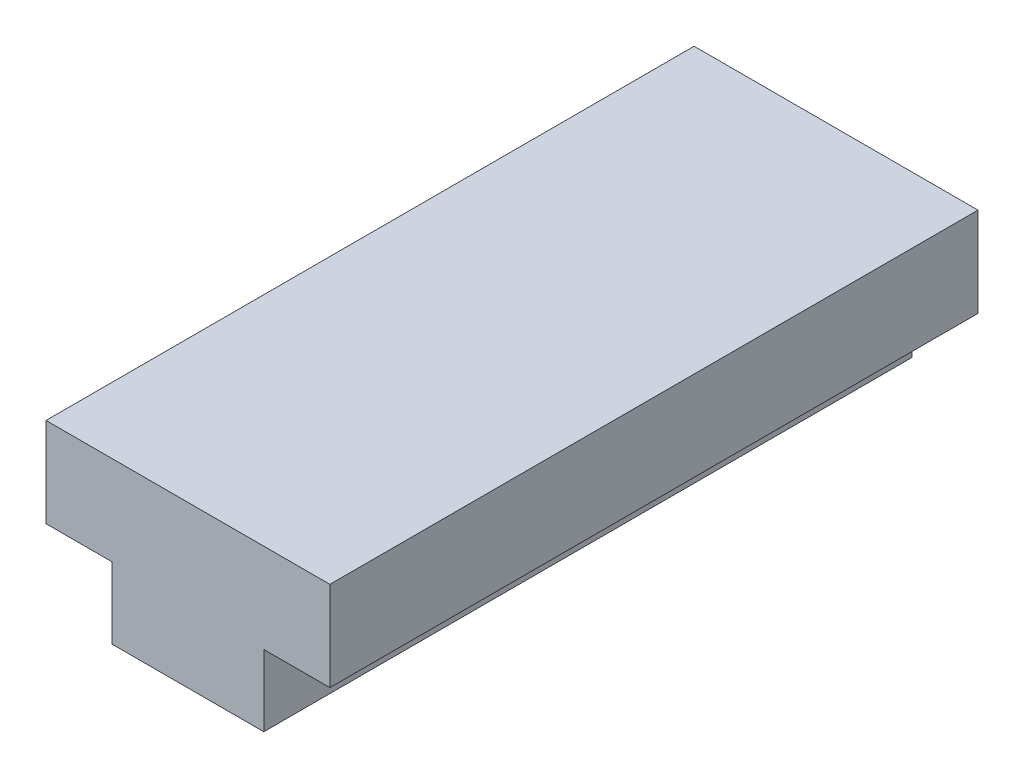
ISO-10303-21;
HEADER;
FILE_DESCRIPTION(('STEP AP214'),'2;1');
FILE_NAME('part.step','',(''),(''),'','','');
FILE_SCHEMA(('AUTOMOTIVE_DESIGN { 1 0 10303 214 1 1 1 1 }'));
ENDSEC;
DATA;
#1=APPLICATION_CONTEXT('core data for automotive mechanical design processes');
#2=APPLICATION_PROTOCOL_DEFINITION('international standard','automotive_design',2000,#1);
#3=PRODUCT_CONTEXT('',#1,'mechanical');
#4=PRODUCT('Part','Part','',(#3));
#5=PRODUCT_RELATED_PRODUCT_CATEGORY('part','',(#4));
#6=PRODUCT_DEFINITION_FORMATION('','',#4);
#7=PRODUCT_DEFINITION_CONTEXT('part definition',#1,'design');
#8=PRODUCT_DEFINITION('design','',#6,#7);
#9=PRODUCT_DEFINITION_SHAPE('','',#8);
#10=(LENGTH_UNIT() NAMED_UNIT(*) SI_UNIT(.MILLI.,.METRE.));
#11=(NAMED_UNIT(*) PLANE_ANGLE_UNIT() SI_UNIT($,.RADIAN.));
#12=(NAMED_UNIT(*) SI_UNIT($,.STERADIAN.) SOLID_ANGLE_UNIT());
#13=UNCERTAINTY_MEASURE_WITH_UNIT(LENGTH_MEASURE(1.E-05),#10,'distance_accuracy_value','');
#14=(GEOMETRIC_REPRESENTATION_CONTEXT(3) GLOBAL_UNCERTAINTY_ASSIGNED_CONTEXT((#13)) GLOBAL_UNIT_ASSIGNED_CONTEXT((#10,
#11,#12)) REPRESENTATION_CONTEXT('',''));
#15=CARTESIAN_POINT('',(0.,0.,0.));
#16=DIRECTION('',(0.,0.,1.));
#17=DIRECTION('',(1.,0.,0.));
#18=AXIS2_PLACEMENT_3D('',#15,#16,#17);
#19=CARTESIAN_POINT('',(5.85,0.,-50.));
#20=DIRECTION('',(-1.,0.,0.));
#21=DIRECTION('',(0.,0.,1.));
#22=AXIS2_PLACEMENT_3D('',#19,#20,#21);
#23=PLANE('',#22);
#24=DIRECTION('',(0.,-1.,0.));
#25=VECTOR('',#24,1.);
#26=CARTESIAN_POINT('',(5.85,0.,0.));
#27=LINE('',#26,#25);
#28=CARTESIAN_POINT('',(5.85,0.,0.));
#29=VERTEX_POINT('',#28);
#30=CARTESIAN_POINT('',(5.85,-5.5,0.));
#31=VERTEX_POINT('',#30);
#32=EDGE_CURVE('E133',#29,#31,#27,.T.);
#33=ORIENTED_EDGE('',*,*,#32,.T.);
#34=DIRECTION('',(0.,0.,1.));
#35=VECTOR('',#34,1.);
#36=CARTESIAN_POINT('',(5.85,-5.5,-50.));
#37=LINE('',#36,#35);
#38=CARTESIAN_POINT('',(5.85,-5.5,-50.));
#39=VERTEX_POINT('',#38);
#40=EDGE_CURVE('E11',#39,#31,#37,.T.);
#41=ORIENTED_EDGE('',*,*,#40,.F.);
#42=DIRECTION('',(0.,-1.,0.));
#43=VECTOR('',#42,1.);
#44=CARTESIAN_POINT('',(5.85,0.,-50.));
#45=LINE('',#44,#43);
#46=CARTESIAN_POINT('',(5.85,0.,-50.));
#47=VERTEX_POINT('',#46);
#48=EDGE_CURVE('E55',#47,#39,#45,.T.);
#49=ORIENTED_EDGE('',*,*,#48,.F.);
#50=DIRECTION('',(0.,0.,1.));
#51=VECTOR('',#50,1.);
#52=CARTESIAN_POINT('',(5.85,0.,-50.));
#53=LINE('',#52,#51);
#54=EDGE_CURVE('E40',#47,#29,#53,.T.);
#55=ORIENTED_EDGE('',*,*,#54,.T.);
#56=EDGE_LOOP('',(#33,#41,#49,#55));
#57=FACE_BOUND('',#56,.T.);
#58=ADVANCED_FACE('F37',(#57),#23,.F.);
#59=CARTESIAN_POINT('',(0.,-5.5,-50.));
#60=DIRECTION('',(0.,-1.,0.));
#61=DIRECTION('',(0.,0.,-1.));
#62=AXIS2_PLACEMENT_3D('',#59,#60,#61);
#63=PLANE('',#62);
#64=DIRECTION('',(1.,0.,0.));
#65=VECTOR('',#64,1.);
#66=CARTESIAN_POINT('',(0.,-5.5,0.));
#67=LINE('',#66,#65);
#68=CARTESIAN_POINT('',(-5.85,-5.5,0.));
#69=VERTEX_POINT('',#68);
#70=EDGE_CURVE('E148',#69,#31,#67,.T.);
#71=ORIENTED_EDGE('',*,*,#70,.F.);
#72=DIRECTION('',(0.,0.,1.));
#73=VECTOR('',#72,1.);
#74=CARTESIAN_POINT('',(-5.85,-5.5,-50.));
#75=LINE('',#74,#73);
#76=CARTESIAN_POINT('',(-5.85,-5.5,-50.));
#77=VERTEX_POINT('',#76);
#78=EDGE_CURVE('E46',#77,#69,#75,.T.);
#79=ORIENTED_EDGE('',*,*,#78,.F.);
#80=DIRECTION('',(1.,0.,0.));
#81=VECTOR('',#80,1.);
#82=CARTESIAN_POINT('',(0.,-5.5,-50.));
#83=LINE('',#82,#81);
#84=EDGE_CURVE('E123',#77,#39,#83,.T.);
#85=ORIENTED_EDGE('',*,*,#84,.T.);
#86=ORIENTED_EDGE('',*,*,#40,.T.);
#87=EDGE_LOOP('',(#71,#79,#85,#86));
#88=FACE_BOUND('',#87,.T.);
#89=ADVANCED_FACE('F167',(#88),#63,.T.);
#90=CARTESIAN_POINT('',(-5.85,0.,-50.));
#91=DIRECTION('',(-1.,0.,0.));
#92=DIRECTION('',(0.,0.,1.));
#93=AXIS2_PLACEMENT_3D('',#90,#91,#92);
#94=PLANE('',#93);
#95=DIRECTION('',(0.,-1.,0.));
#96=VECTOR('',#95,1.);
#97=CARTESIAN_POINT('',(-5.85,0.,0.));
#98=LINE('',#97,#96);
#99=CARTESIAN_POINT('',(-5.85,0.,0.));
#100=VERTEX_POINT('',#99);
#101=EDGE_CURVE('E111',#100,#69,#98,.T.);
#102=ORIENTED_EDGE('',*,*,#101,.F.);
#103=DIRECTION('',(0.,0.,1.));
#104=VECTOR('',#103,1.);
#105=CARTESIAN_POINT('',(-5.85,0.,-50.));
#106=LINE('',#105,#104);
#107=CARTESIAN_POINT('',(-5.85,0.,-50.));
#108=VERTEX_POINT('',#107);
#109=EDGE_CURVE('E107',#108,#100,#106,.T.);
#110=ORIENTED_EDGE('',*,*,#109,.F.);
#111=DIRECTION('',(0.,-1.,0.));
#112=VECTOR('',#111,1.);
#113=CARTESIAN_POINT('',(-5.85,0.,-50.));
#114=LINE('',#113,#112);
#115=EDGE_CURVE('E110',#108,#77,#114,.T.);
#116=ORIENTED_EDGE('',*,*,#115,.T.);
#117=ORIENTED_EDGE('',*,*,#78,.T.);
#118=EDGE_LOOP('',(#102,#110,#116,#117));
#119=FACE_BOUND('',#118,.T.);
#120=ADVANCED_FACE('F109',(#119),#94,.T.);
#121=CARTESIAN_POINT('',(0.,0.,-50.));
#122=DIRECTION('',(0.,-1.,0.));
#123=DIRECTION('',(1.,0.,0.));
#124=AXIS2_PLACEMENT_3D('',#121,#122,#123);
#125=PLANE('',#124);
#126=DIRECTION('',(1.,0.,0.));
#127=VECTOR('',#126,1.);
#128=CARTESIAN_POINT('',(0.,0.,0.));
#129=LINE('',#128,#127);
#130=CARTESIAN_POINT('',(-10.95,0.,0.));
#131=VERTEX_POINT('',#130);
#132=EDGE_CURVE('E145',#131,#100,#129,.T.);
#133=ORIENTED_EDGE('',*,*,#132,.F.);
#134=DIRECTION('',(0.,0.,1.));
#135=VECTOR('',#134,1.);
#136=CARTESIAN_POINT('',(-10.95,0.,-50.));
#137=LINE('',#136,#135);
#138=CARTESIAN_POINT('',(-10.95,0.,-50.));
#139=VERTEX_POINT('',#138);
#140=EDGE_CURVE('E116',#139,#131,#137,.T.);
#141=ORIENTED_EDGE('',*,*,#140,.F.);
#142=DIRECTION('',(1.,0.,0.));
#143=VECTOR('',#142,1.);
#144=CARTESIAN_POINT('',(0.,0.,-50.));
#145=LINE('',#144,#143);
#146=EDGE_CURVE('E121',#139,#108,#145,.T.);
#147=ORIENTED_EDGE('',*,*,#146,.T.);
#148=ORIENTED_EDGE('',*,*,#109,.T.);
#149=EDGE_LOOP('',(#133,#141,#147,#148));
#150=FACE_BOUND('',#149,.T.);
#151=ADVANCED_FACE('F125',(#150),#125,.T.);
#152=CARTESIAN_POINT('',(-10.95,0.,-50.));
#153=DIRECTION('',(-1.,0.,0.));
#154=DIRECTION('',(0.,0.,1.));
#155=AXIS2_PLACEMENT_3D('',#152,#153,#154);
#156=PLANE('',#155);
#157=DIRECTION('',(0.,-1.,0.));
#158=VECTOR('',#157,1.);
#159=CARTESIAN_POINT('',(-10.95,0.,0.));
#160=LINE('',#159,#158);
#161=CARTESIAN_POINT('',(-10.95,6.9,0.));
#162=VERTEX_POINT('',#161);
#163=EDGE_CURVE('E142',#162,#131,#160,.T.);
#164=ORIENTED_EDGE('',*,*,#163,.F.);
#165=DIRECTION('',(0.,0.,1.));
#166=VECTOR('',#165,1.);
#167=CARTESIAN_POINT('',(-10.95,6.9,-50.));
#168=LINE('',#167,#166);
#169=CARTESIAN_POINT('',(-10.95,6.9,-50.));
#170=VERTEX_POINT('',#169);
#171=EDGE_CURVE('E153',#170,#162,#168,.T.);
#172=ORIENTED_EDGE('',*,*,#171,.F.);
#173=DIRECTION('',(0.,-1.,0.));
#174=VECTOR('',#173,1.);
#175=CARTESIAN_POINT('',(-10.95,0.,-50.));
#176=LINE('',#175,#174);
#177=EDGE_CURVE('E126',#170,#139,#176,.T.);
#178=ORIENTED_EDGE('',*,*,#177,.T.);
#179=ORIENTED_EDGE('',*,*,#140,.T.);
#180=EDGE_LOOP('',(#164,#172,#178,#179));
#181=FACE_BOUND('',#180,.T.);
#182=ADVANCED_FACE('F180',(#181),#156,.T.);
#183=CARTESIAN_POINT('',(0.,6.9,-50.));
#184=DIRECTION('',(0.,1.,0.));
#185=DIRECTION('',(-1.,0.,0.));
#186=AXIS2_PLACEMENT_3D('',#183,#184,#185);
#187=PLANE('',#186);
#188=DIRECTION('',(-1.,0.,0.));
#189=VECTOR('',#188,1.);
#190=CARTESIAN_POINT('',(0.,6.9,0.));
#191=LINE('',#190,#189);
#192=CARTESIAN_POINT('',(10.95,6.9,0.));
#193=VERTEX_POINT('',#192);
#194=EDGE_CURVE('E139',#193,#162,#191,.T.);
#195=ORIENTED_EDGE('',*,*,#194,.F.);
#196=DIRECTION('',(0.,0.,1.));
#197=VECTOR('',#196,1.);
#198=CARTESIAN_POINT('',(10.95,6.9,-50.));
#199=LINE('',#198,#197);
#200=CARTESIAN_POINT('',(10.95,6.9,-50.));
#201=VERTEX_POINT('',#200);
#202=EDGE_CURVE('E155',#201,#193,#199,.T.);
#203=ORIENTED_EDGE('',*,*,#202,.F.);
#204=DIRECTION('',(-1.,0.,0.));
#205=VECTOR('',#204,1.);
#206=CARTESIAN_POINT('',(0.,6.9,-50.));
#207=LINE('',#206,#205);
#208=EDGE_CURVE('E128',#201,#170,#207,.T.);
#209=ORIENTED_EDGE('',*,*,#208,.T.);
#210=ORIENTED_EDGE('',*,*,#171,.T.);
#211=EDGE_LOOP('',(#195,#203,#209,#210));
#212=FACE_BOUND('',#211,.T.);
#213=ADVANCED_FACE('F183',(#212),#187,.T.);
#214=CARTESIAN_POINT('',(10.95,0.,-50.));
#215=DIRECTION('',(-1.,0.,0.));
#216=DIRECTION('',(0.,0.,1.));
#217=AXIS2_PLACEMENT_3D('',#214,#215,#216);
#218=PLANE('',#217);
#219=DIRECTION('',(0.,-1.,0.));
#220=VECTOR('',#219,1.);
#221=CARTESIAN_POINT('',(10.95,0.,0.));
#222=LINE('',#221,#220);
#223=CARTESIAN_POINT('',(10.95,0.,0.));
#224=VERTEX_POINT('',#223);
#225=EDGE_CURVE('E137',#193,#224,#222,.T.);
#226=ORIENTED_EDGE('',*,*,#225,.T.);
#227=DIRECTION('',(0.,0.,1.));
#228=VECTOR('',#227,1.);
#229=CARTESIAN_POINT('',(10.95,0.,-50.));
#230=LINE('',#229,#228);
#231=CARTESIAN_POINT('',(10.95,0.,-50.));
#232=VERTEX_POINT('',#231);
#233=EDGE_CURVE('E156',#232,#224,#230,.T.);
#234=ORIENTED_EDGE('',*,*,#233,.F.);
#235=DIRECTION('',(0.,-1.,0.));
#236=VECTOR('',#235,1.);
#237=CARTESIAN_POINT('',(10.95,0.,-50.));
#238=LINE('',#237,#236);
#239=EDGE_CURVE('E261',#201,#232,#238,.T.);
#240=ORIENTED_EDGE('',*,*,#239,.F.);
#241=ORIENTED_EDGE('',*,*,#202,.T.);
#242=EDGE_LOOP('',(#226,#234,#240,#241));
#243=FACE_BOUND('',#242,.T.);
#244=ADVANCED_FACE('F187',(#243),#218,.F.);
#245=CARTESIAN_POINT('',(0.,0.,-50.));
#246=DIRECTION('',(0.,1.,0.));
#247=DIRECTION('',(-1.,0.,0.));
#248=AXIS2_PLACEMENT_3D('',#245,#246,#247);
#249=PLANE('',#248);
#250=DIRECTION('',(-1.,0.,0.));
#251=VECTOR('',#250,1.);
#252=CARTESIAN_POINT('',(0.,0.,0.));
#253=LINE('',#252,#251);
#254=EDGE_CURVE('E135',#224,#29,#253,.T.);
#255=ORIENTED_EDGE('',*,*,#254,.T.);
#256=ORIENTED_EDGE('',*,*,#54,.F.);
#257=DIRECTION('',(-1.,0.,0.));
#258=VECTOR('',#257,1.);
#259=CARTESIAN_POINT('',(0.,0.,-50.));
#260=LINE('',#259,#258);
#261=EDGE_CURVE('E94',#232,#47,#260,.T.);
#262=ORIENTED_EDGE('',*,*,#261,.F.);
#263=ORIENTED_EDGE('',*,*,#233,.T.);
#264=EDGE_LOOP('',(#255,#256,#262,#263));
#265=FACE_BOUND('',#264,.T.);
#266=ADVANCED_FACE('F190',(#265),#249,.F.);
#267=CARTESIAN_POINT('',(0.,0.,-50.));
#268=DIRECTION('',(0.,0.,1.));
#269=DIRECTION('',(1.,0.,0.));
#270=AXIS2_PLACEMENT_3D('',#267,#268,#269);
#271=PLANE('',#270);
#272=ORIENTED_EDGE('',*,*,#48,.T.);
#273=ORIENTED_EDGE('',*,*,#84,.F.);
#274=ORIENTED_EDGE('',*,*,#115,.F.);
#275=ORIENTED_EDGE('',*,*,#146,.F.);
#276=ORIENTED_EDGE('',*,*,#177,.F.);
#277=ORIENTED_EDGE('',*,*,#208,.F.);
#278=ORIENTED_EDGE('',*,*,#239,.T.);
#279=ORIENTED_EDGE('',*,*,#261,.T.);
#280=EDGE_LOOP('',(#272,#273,#274,#275,#276,#277,#278,#279));
#281=FACE_BOUND('',#280,.T.);
#282=ADVANCED_FACE('F119',(#281),#271,.F.);
#283=CARTESIAN_POINT('',(0.,0.,0.));
#284=DIRECTION('',(0.,0.,1.));
#285=DIRECTION('',(1.,0.,0.));
#286=AXIS2_PLACEMENT_3D('',#283,#284,#285);
#287=PLANE('',#286);
#288=ORIENTED_EDGE('',*,*,#32,.F.);
#289=ORIENTED_EDGE('',*,*,#254,.F.);
#290=ORIENTED_EDGE('',*,*,#225,.F.);
#291=ORIENTED_EDGE('',*,*,#194,.T.);
#292=ORIENTED_EDGE('',*,*,#163,.T.);
#293=ORIENTED_EDGE('',*,*,#132,.T.);
#294=ORIENTED_EDGE('',*,*,#101,.T.);
#295=ORIENTED_EDGE('',*,*,#70,.T.);
#296=EDGE_LOOP('',(#288,#289,#290,#291,#292,#293,#294,#295));
#297=FACE_BOUND('',#296,.T.);
#298=ADVANCED_FACE('F165',(#297),#287,.T.);
#299=CLOSED_SHELL('',(#58,#89,#120,#151,#182,#213,#244,#266,#282,#298));
#300=MANIFOLD_SOLID_BREP('B2',#299);
#301=ADVANCED_BREP_SHAPE_REPRESENTATION('',(#18,#300),#14);
#302=SHAPE_DEFINITION_REPRESENTATION(#9,#301);
ENDSEC;
END-ISO-10303-21;
